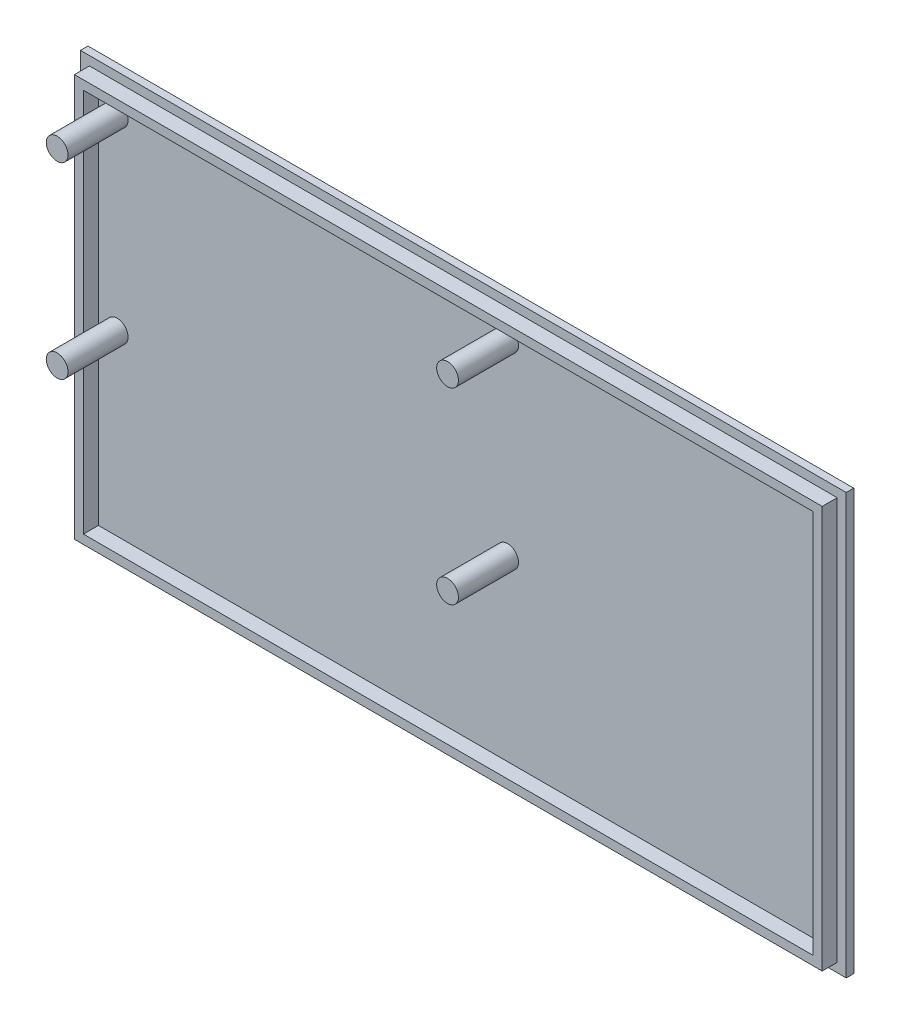
ISO-10303-21;
HEADER;
FILE_DESCRIPTION(('STEP AP214'),'2;1');
FILE_NAME('part.step','',(''),(''),'','','');
FILE_SCHEMA(('AUTOMOTIVE_DESIGN { 1 0 10303 214 1 1 1 1 }'));
ENDSEC;
DATA;
#1=APPLICATION_CONTEXT('core data for automotive mechanical design processes');
#2=APPLICATION_PROTOCOL_DEFINITION('international standard','automotive_design',2000,#1);
#3=PRODUCT_CONTEXT('',#1,'mechanical');
#4=PRODUCT('Part','Part','',(#3));
#5=PRODUCT_RELATED_PRODUCT_CATEGORY('part','',(#4));
#6=PRODUCT_DEFINITION_FORMATION('','',#4);
#7=PRODUCT_DEFINITION_CONTEXT('part definition',#1,'design');
#8=PRODUCT_DEFINITION('design','',#6,#7);
#9=PRODUCT_DEFINITION_SHAPE('','',#8);
#10=(LENGTH_UNIT() NAMED_UNIT(*) SI_UNIT(.MILLI.,.METRE.));
#11=(NAMED_UNIT(*) PLANE_ANGLE_UNIT() SI_UNIT($,.RADIAN.));
#12=(NAMED_UNIT(*) SI_UNIT($,.STERADIAN.) SOLID_ANGLE_UNIT());
#13=UNCERTAINTY_MEASURE_WITH_UNIT(LENGTH_MEASURE(1.E-05),#10,'distance_accuracy_value','');
#14=(GEOMETRIC_REPRESENTATION_CONTEXT(3) GLOBAL_UNCERTAINTY_ASSIGNED_CONTEXT((#13)) GLOBAL_UNIT_ASSIGNED_CONTEXT((#10,
#11,#12)) REPRESENTATION_CONTEXT('',''));
#15=CARTESIAN_POINT('',(0.,0.,0.));
#16=DIRECTION('',(0.,0.,1.));
#17=DIRECTION('',(1.,0.,0.));
#18=AXIS2_PLACEMENT_3D('',#15,#16,#17);
#19=CARTESIAN_POINT('',(0.,0.,1.));
#20=DIRECTION('',(0.,0.,-1.));
#21=DIRECTION('',(-1.,0.,0.));
#22=AXIS2_PLACEMENT_3D('',#19,#20,#21);
#23=PLANE('',#22);
#24=DIRECTION('',(0.,1.,0.));
#25=VECTOR('',#24,1.);
#26=CARTESIAN_POINT('',(51.,-28.,1.));
#27=LINE('',#26,#25);
#28=CARTESIAN_POINT('',(51.,-28.,1.));
#29=VERTEX_POINT('',#28);
#30=CARTESIAN_POINT('',(51.,28.,1.));
#31=VERTEX_POINT('',#30);
#32=EDGE_CURVE('E193',#29,#31,#27,.T.);
#33=ORIENTED_EDGE('',*,*,#32,.T.);
#34=DIRECTION('',(-1.,0.,0.));
#35=VECTOR('',#34,1.);
#36=CARTESIAN_POINT('',(-51.,28.,1.));
#37=LINE('',#36,#35);
#38=CARTESIAN_POINT('',(-51.,28.,1.));
#39=VERTEX_POINT('',#38);
#40=EDGE_CURVE('E196',#31,#39,#37,.T.);
#41=ORIENTED_EDGE('',*,*,#40,.T.);
#42=DIRECTION('',(0.,-1.,0.));
#43=VECTOR('',#42,1.);
#44=CARTESIAN_POINT('',(-51.,-28.,1.));
#45=LINE('',#44,#43);
#46=CARTESIAN_POINT('',(-51.,-28.,1.));
#47=VERTEX_POINT('',#46);
#48=EDGE_CURVE('E199',#39,#47,#45,.T.);
#49=ORIENTED_EDGE('',*,*,#48,.T.);
#50=DIRECTION('',(1.,0.,0.));
#51=VECTOR('',#50,1.);
#52=CARTESIAN_POINT('',(-51.,-28.,1.));
#53=LINE('',#52,#51);
#54=EDGE_CURVE('E201',#47,#29,#53,.T.);
#55=ORIENTED_EDGE('',*,*,#54,.T.);
#56=EDGE_LOOP('',(#33,#41,#49,#55));
#57=FACE_BOUND('',#56,.T.);
#58=DIRECTION('',(0.,1.,0.));
#59=VECTOR('',#58,1.);
#60=CARTESIAN_POINT('',(49.8,-26.8,1.));
#61=LINE('',#60,#59);
#62=CARTESIAN_POINT('',(49.8,-26.8,1.));
#63=VERTEX_POINT('',#62);
#64=CARTESIAN_POINT('',(49.8,26.8,1.));
#65=VERTEX_POINT('',#64);
#66=EDGE_CURVE('E139',#63,#65,#61,.T.);
#67=ORIENTED_EDGE('',*,*,#66,.F.);
#68=DIRECTION('',(1.,0.,0.));
#69=VECTOR('',#68,1.);
#70=CARTESIAN_POINT('',(-49.8,-26.8,1.));
#71=LINE('',#70,#69);
#72=CARTESIAN_POINT('',(-49.8,-26.8,1.));
#73=VERTEX_POINT('',#72);
#74=EDGE_CURVE('E169',#73,#63,#71,.T.);
#75=ORIENTED_EDGE('',*,*,#74,.F.);
#76=DIRECTION('',(0.,-1.,0.));
#77=VECTOR('',#76,1.);
#78=CARTESIAN_POINT('',(-49.8,-26.8,1.));
#79=LINE('',#78,#77);
#80=CARTESIAN_POINT('',(-49.8,26.8,1.));
#81=VERTEX_POINT('',#80);
#82=EDGE_CURVE('E53',#81,#73,#79,.T.);
#83=ORIENTED_EDGE('',*,*,#82,.F.);
#84=DIRECTION('',(-1.,0.,0.));
#85=VECTOR('',#84,1.);
#86=CARTESIAN_POINT('',(-49.8,26.8,1.));
#87=LINE('',#86,#85);
#88=EDGE_CURVE('E48',#65,#81,#87,.T.);
#89=ORIENTED_EDGE('',*,*,#88,.F.);
#90=EDGE_LOOP('',(#67,#75,#83,#89));
#91=FACE_BOUND('',#90,.T.);
#92=ADVANCED_FACE('F33',(#57,#91),#23,.F.);
#93=CARTESIAN_POINT('',(51.,-28.,1.));
#94=DIRECTION('',(-1.,0.,0.));
#95=DIRECTION('',(0.,0.,1.));
#96=AXIS2_PLACEMENT_3D('',#93,#94,#95);
#97=PLANE('',#96);
#98=DIRECTION('',(0.,1.,0.));
#99=VECTOR('',#98,1.);
#100=CARTESIAN_POINT('',(51.,-28.,0.));
#101=LINE('',#100,#99);
#102=CARTESIAN_POINT('',(51.,-28.,0.));
#103=VERTEX_POINT('',#102);
#104=CARTESIAN_POINT('',(51.,28.,0.));
#105=VERTEX_POINT('',#104);
#106=EDGE_CURVE('E192',#103,#105,#101,.T.);
#107=ORIENTED_EDGE('',*,*,#106,.T.);
#108=DIRECTION('',(0.,0.,-1.));
#109=VECTOR('',#108,1.);
#110=CARTESIAN_POINT('',(51.,28.,1.));
#111=LINE('',#110,#109);
#112=EDGE_CURVE('E219',#31,#105,#111,.T.);
#113=ORIENTED_EDGE('',*,*,#112,.F.);
#114=ORIENTED_EDGE('',*,*,#32,.F.);
#115=DIRECTION('',(0.,0.,-1.));
#116=VECTOR('',#115,1.);
#117=CARTESIAN_POINT('',(51.,-28.,1.));
#118=LINE('',#117,#116);
#119=EDGE_CURVE('E203',#29,#103,#118,.T.);
#120=ORIENTED_EDGE('',*,*,#119,.T.);
#121=EDGE_LOOP('',(#107,#113,#114,#120));
#122=FACE_BOUND('',#121,.T.);
#123=ADVANCED_FACE('F35',(#122),#97,.F.);
#124=CARTESIAN_POINT('',(-51.,28.,1.));
#125=DIRECTION('',(0.,-1.,0.));
#126=DIRECTION('',(0.,0.,-1.));
#127=AXIS2_PLACEMENT_3D('',#124,#125,#126);
#128=PLANE('',#127);
#129=DIRECTION('',(-1.,0.,0.));
#130=VECTOR('',#129,1.);
#131=CARTESIAN_POINT('',(-51.,28.,0.));
#132=LINE('',#131,#130);
#133=CARTESIAN_POINT('',(-51.,28.,0.));
#134=VERTEX_POINT('',#133);
#135=EDGE_CURVE('E206',#105,#134,#132,.T.);
#136=ORIENTED_EDGE('',*,*,#135,.T.);
#137=DIRECTION('',(0.,0.,-1.));
#138=VECTOR('',#137,1.);
#139=CARTESIAN_POINT('',(-51.,28.,1.));
#140=LINE('',#139,#138);
#141=EDGE_CURVE('E216',#39,#134,#140,.T.);
#142=ORIENTED_EDGE('',*,*,#141,.F.);
#143=ORIENTED_EDGE('',*,*,#40,.F.);
#144=ORIENTED_EDGE('',*,*,#112,.T.);
#145=EDGE_LOOP('',(#136,#142,#143,#144));
#146=FACE_BOUND('',#145,.T.);
#147=ADVANCED_FACE('F261',(#146),#128,.F.);
#148=CARTESIAN_POINT('',(-51.,-28.,1.));
#149=DIRECTION('',(1.,0.,0.));
#150=DIRECTION('',(0.,0.,-1.));
#151=AXIS2_PLACEMENT_3D('',#148,#149,#150);
#152=PLANE('',#151);
#153=DIRECTION('',(0.,-1.,0.));
#154=VECTOR('',#153,1.);
#155=CARTESIAN_POINT('',(-51.,-28.,0.));
#156=LINE('',#155,#154);
#157=CARTESIAN_POINT('',(-51.,-28.,0.));
#158=VERTEX_POINT('',#157);
#159=EDGE_CURVE('E208',#134,#158,#156,.T.);
#160=ORIENTED_EDGE('',*,*,#159,.T.);
#161=DIRECTION('',(0.,0.,-1.));
#162=VECTOR('',#161,1.);
#163=CARTESIAN_POINT('',(-51.,-28.,1.));
#164=LINE('',#163,#162);
#165=EDGE_CURVE('E213',#47,#158,#164,.T.);
#166=ORIENTED_EDGE('',*,*,#165,.F.);
#167=ORIENTED_EDGE('',*,*,#48,.F.);
#168=ORIENTED_EDGE('',*,*,#141,.T.);
#169=EDGE_LOOP('',(#160,#166,#167,#168));
#170=FACE_BOUND('',#169,.T.);
#171=ADVANCED_FACE('F274',(#170),#152,.F.);
#172=CARTESIAN_POINT('',(-51.,-28.,1.));
#173=DIRECTION('',(0.,1.,0.));
#174=DIRECTION('',(0.,0.,1.));
#175=AXIS2_PLACEMENT_3D('',#172,#173,#174);
#176=PLANE('',#175);
#177=DIRECTION('',(1.,0.,0.));
#178=VECTOR('',#177,1.);
#179=CARTESIAN_POINT('',(-51.,-28.,0.));
#180=LINE('',#179,#178);
#181=EDGE_CURVE('E197',#158,#103,#180,.T.);
#182=ORIENTED_EDGE('',*,*,#181,.T.);
#183=ORIENTED_EDGE('',*,*,#119,.F.);
#184=ORIENTED_EDGE('',*,*,#54,.F.);
#185=ORIENTED_EDGE('',*,*,#165,.T.);
#186=EDGE_LOOP('',(#182,#183,#184,#185));
#187=FACE_BOUND('',#186,.T.);
#188=ADVANCED_FACE('F270',(#187),#176,.F.);
#189=CARTESIAN_POINT('',(0.,0.,0.));
#190=DIRECTION('',(0.,0.,-1.));
#191=DIRECTION('',(-1.,0.,0.));
#192=AXIS2_PLACEMENT_3D('',#189,#190,#191);
#193=PLANE('',#192);
#194=ORIENTED_EDGE('',*,*,#106,.F.);
#195=ORIENTED_EDGE('',*,*,#181,.F.);
#196=ORIENTED_EDGE('',*,*,#159,.F.);
#197=ORIENTED_EDGE('',*,*,#135,.F.);
#198=EDGE_LOOP('',(#194,#195,#196,#197));
#199=FACE_BOUND('',#198,.T.);
#200=ADVANCED_FACE('F267',(#199),#193,.T.);
#201=CARTESIAN_POINT('',(0.,0.,3.));
#202=DIRECTION('',(0.,0.,-1.));
#203=DIRECTION('',(-1.,0.,0.));
#204=AXIS2_PLACEMENT_3D('',#201,#202,#203);
#205=PLANE('',#204);
#206=DIRECTION('',(0.,1.,0.));
#207=VECTOR('',#206,1.);
#208=CARTESIAN_POINT('',(49.8,-26.8,3.));
#209=LINE('',#208,#207);
#210=CARTESIAN_POINT('',(49.8,-26.8,3.));
#211=VERTEX_POINT('',#210);
#212=CARTESIAN_POINT('',(49.8,26.8,3.));
#213=VERTEX_POINT('',#212);
#214=EDGE_CURVE('E165',#211,#213,#209,.T.);
#215=ORIENTED_EDGE('',*,*,#214,.T.);
#216=DIRECTION('',(-1.,0.,0.));
#217=VECTOR('',#216,1.);
#218=CARTESIAN_POINT('',(-49.8,26.8,3.));
#219=LINE('',#218,#217);
#220=CARTESIAN_POINT('',(-49.8,26.8,3.));
#221=VERTEX_POINT('',#220);
#222=EDGE_CURVE('E168',#213,#221,#219,.T.);
#223=ORIENTED_EDGE('',*,*,#222,.T.);
#224=DIRECTION('',(0.,-1.,0.));
#225=VECTOR('',#224,1.);
#226=CARTESIAN_POINT('',(-49.8,-26.8,3.));
#227=LINE('',#226,#225);
#228=CARTESIAN_POINT('',(-49.8,-26.8,3.));
#229=VERTEX_POINT('',#228);
#230=EDGE_CURVE('E171',#221,#229,#227,.T.);
#231=ORIENTED_EDGE('',*,*,#230,.T.);
#232=DIRECTION('',(1.,0.,0.));
#233=VECTOR('',#232,1.);
#234=CARTESIAN_POINT('',(-49.8,-26.8,3.));
#235=LINE('',#234,#233);
#236=EDGE_CURVE('E173',#229,#211,#235,.T.);
#237=ORIENTED_EDGE('',*,*,#236,.T.);
#238=EDGE_LOOP('',(#215,#223,#231,#237));
#239=FACE_BOUND('',#238,.T.);
#240=DIRECTION('',(0.,1.,0.));
#241=VECTOR('',#240,1.);
#242=CARTESIAN_POINT('',(48.6,-25.6,3.));
#243=LINE('',#242,#241);
#244=CARTESIAN_POINT('',(48.6,-25.6,3.));
#245=VERTEX_POINT('',#244);
#246=CARTESIAN_POINT('',(48.6,25.6,3.));
#247=VERTEX_POINT('',#246);
#248=EDGE_CURVE('E121',#245,#247,#243,.T.);
#249=ORIENTED_EDGE('',*,*,#248,.F.);
#250=DIRECTION('',(1.,0.,0.));
#251=VECTOR('',#250,1.);
#252=CARTESIAN_POINT('',(-48.6,-25.6,3.));
#253=LINE('',#252,#251);
#254=CARTESIAN_POINT('',(-48.6,-25.6,3.));
#255=VERTEX_POINT('',#254);
#256=EDGE_CURVE('E147',#255,#245,#253,.T.);
#257=ORIENTED_EDGE('',*,*,#256,.F.);
#258=DIRECTION('',(0.,-1.,0.));
#259=VECTOR('',#258,1.);
#260=CARTESIAN_POINT('',(-48.6,-25.6,3.));
#261=LINE('',#260,#259);
#262=CARTESIAN_POINT('',(-48.6,25.6,3.));
#263=VERTEX_POINT('',#262);
#264=EDGE_CURVE('E145',#263,#255,#261,.T.);
#265=ORIENTED_EDGE('',*,*,#264,.F.);
#266=DIRECTION('',(-1.,0.,0.));
#267=VECTOR('',#266,1.);
#268=CARTESIAN_POINT('',(-48.6,25.6,3.));
#269=LINE('',#268,#267);
#270=EDGE_CURVE('E131',#247,#263,#269,.T.);
#271=ORIENTED_EDGE('',*,*,#270,.F.);
#272=EDGE_LOOP('',(#249,#257,#265,#271));
#273=FACE_BOUND('',#272,.T.);
#274=ADVANCED_FACE('F143',(#239,#273),#205,.F.);
#275=CARTESIAN_POINT('',(49.8,-26.8,3.));
#276=DIRECTION('',(-1.,0.,0.));
#277=DIRECTION('',(0.,0.,1.));
#278=AXIS2_PLACEMENT_3D('',#275,#276,#277);
#279=PLANE('',#278);
#280=ORIENTED_EDGE('',*,*,#66,.T.);
#281=DIRECTION('',(0.,0.,-1.));
#282=VECTOR('',#281,1.);
#283=CARTESIAN_POINT('',(49.8,26.8,3.));
#284=LINE('',#283,#282);
#285=EDGE_CURVE('E190',#213,#65,#284,.T.);
#286=ORIENTED_EDGE('',*,*,#285,.F.);
#287=ORIENTED_EDGE('',*,*,#214,.F.);
#288=DIRECTION('',(0.,0.,-1.));
#289=VECTOR('',#288,1.);
#290=CARTESIAN_POINT('',(49.8,-26.8,3.));
#291=LINE('',#290,#289);
#292=EDGE_CURVE('E175',#211,#63,#291,.T.);
#293=ORIENTED_EDGE('',*,*,#292,.T.);
#294=EDGE_LOOP('',(#280,#286,#287,#293));
#295=FACE_BOUND('',#294,.T.);
#296=ADVANCED_FACE('F265',(#295),#279,.F.);
#297=CARTESIAN_POINT('',(-49.8,26.8,3.));
#298=DIRECTION('',(0.,-1.,0.));
#299=DIRECTION('',(0.,0.,-1.));
#300=AXIS2_PLACEMENT_3D('',#297,#298,#299);
#301=PLANE('',#300);
#302=ORIENTED_EDGE('',*,*,#88,.T.);
#303=DIRECTION('',(0.,0.,-1.));
#304=VECTOR('',#303,1.);
#305=CARTESIAN_POINT('',(-49.8,26.8,3.));
#306=LINE('',#305,#304);
#307=EDGE_CURVE('E187',#221,#81,#306,.T.);
#308=ORIENTED_EDGE('',*,*,#307,.F.);
#309=ORIENTED_EDGE('',*,*,#222,.F.);
#310=ORIENTED_EDGE('',*,*,#285,.T.);
#311=EDGE_LOOP('',(#302,#308,#309,#310));
#312=FACE_BOUND('',#311,.T.);
#313=ADVANCED_FACE('F319',(#312),#301,.F.);
#314=CARTESIAN_POINT('',(-49.8,-26.8,3.));
#315=DIRECTION('',(1.,0.,0.));
#316=DIRECTION('',(0.,0.,-1.));
#317=AXIS2_PLACEMENT_3D('',#314,#315,#316);
#318=PLANE('',#317);
#319=ORIENTED_EDGE('',*,*,#82,.T.);
#320=DIRECTION('',(0.,0.,-1.));
#321=VECTOR('',#320,1.);
#322=CARTESIAN_POINT('',(-49.8,-26.8,3.));
#323=LINE('',#322,#321);
#324=EDGE_CURVE('E184',#229,#73,#323,.T.);
#325=ORIENTED_EDGE('',*,*,#324,.F.);
#326=ORIENTED_EDGE('',*,*,#230,.F.);
#327=ORIENTED_EDGE('',*,*,#307,.T.);
#328=EDGE_LOOP('',(#319,#325,#326,#327));
#329=FACE_BOUND('',#328,.T.);
#330=ADVANCED_FACE('F326',(#329),#318,.F.);
#331=CARTESIAN_POINT('',(-49.8,-26.8,3.));
#332=DIRECTION('',(0.,1.,0.));
#333=DIRECTION('',(0.,0.,1.));
#334=AXIS2_PLACEMENT_3D('',#331,#332,#333);
#335=PLANE('',#334);
#336=ORIENTED_EDGE('',*,*,#74,.T.);
#337=ORIENTED_EDGE('',*,*,#292,.F.);
#338=ORIENTED_EDGE('',*,*,#236,.F.);
#339=ORIENTED_EDGE('',*,*,#324,.T.);
#340=EDGE_LOOP('',(#336,#337,#338,#339));
#341=FACE_BOUND('',#340,.T.);
#342=ADVANCED_FACE('F333',(#341),#335,.F.);
#343=CARTESIAN_POINT('',(48.6,-25.6,3.));
#344=DIRECTION('',(-1.,0.,0.));
#345=DIRECTION('',(0.,0.,1.));
#346=AXIS2_PLACEMENT_3D('',#343,#344,#345);
#347=PLANE('',#346);
#348=DIRECTION('',(0.,1.,0.));
#349=VECTOR('',#348,1.);
#350=CARTESIAN_POINT('',(48.6,-25.6,1.));
#351=LINE('',#350,#349);
#352=CARTESIAN_POINT('',(48.6,-25.6,1.));
#353=VERTEX_POINT('',#352);
#354=CARTESIAN_POINT('',(48.6,25.6,1.));
#355=VERTEX_POINT('',#354);
#356=EDGE_CURVE('E152',#353,#355,#351,.T.);
#357=ORIENTED_EDGE('',*,*,#356,.F.);
#358=DIRECTION('',(0.,0.,-1.));
#359=VECTOR('',#358,1.);
#360=CARTESIAN_POINT('',(48.6,-25.6,3.));
#361=LINE('',#360,#359);
#362=EDGE_CURVE('E127',#245,#353,#361,.T.);
#363=ORIENTED_EDGE('',*,*,#362,.F.);
#364=ORIENTED_EDGE('',*,*,#248,.T.);
#365=DIRECTION('',(0.,0.,-1.));
#366=VECTOR('',#365,1.);
#367=CARTESIAN_POINT('',(48.6,25.6,3.));
#368=LINE('',#367,#366);
#369=EDGE_CURVE('E125',#247,#355,#368,.T.);
#370=ORIENTED_EDGE('',*,*,#369,.T.);
#371=EDGE_LOOP('',(#357,#363,#364,#370));
#372=FACE_BOUND('',#371,.T.);
#373=ADVANCED_FACE('F124',(#372),#347,.T.);
#374=CARTESIAN_POINT('',(-48.6,25.6,3.));
#375=DIRECTION('',(0.,-1.,0.));
#376=DIRECTION('',(0.,0.,-1.));
#377=AXIS2_PLACEMENT_3D('',#374,#375,#376);
#378=PLANE('',#377);
#379=DIRECTION('',(-1.,0.,0.));
#380=VECTOR('',#379,1.);
#381=CARTESIAN_POINT('',(-48.6,25.6,1.));
#382=LINE('',#381,#380);
#383=CARTESIAN_POINT('',(-48.6,25.6,1.));
#384=VERTEX_POINT('',#383);
#385=EDGE_CURVE('E138',#355,#384,#382,.T.);
#386=ORIENTED_EDGE('',*,*,#385,.F.);
#387=ORIENTED_EDGE('',*,*,#369,.F.);
#388=ORIENTED_EDGE('',*,*,#270,.T.);
#389=DIRECTION('',(0.,0.,-1.));
#390=VECTOR('',#389,1.);
#391=CARTESIAN_POINT('',(-48.6,25.6,3.));
#392=LINE('',#391,#390);
#393=EDGE_CURVE('E140',#263,#384,#392,.T.);
#394=ORIENTED_EDGE('',*,*,#393,.T.);
#395=EDGE_LOOP('',(#386,#387,#388,#394));
#396=FACE_BOUND('',#395,.T.);
#397=ADVANCED_FACE('F135',(#396),#378,.T.);
#398=CARTESIAN_POINT('',(-48.6,-25.6,3.));
#399=DIRECTION('',(1.,0.,0.));
#400=DIRECTION('',(0.,0.,-1.));
#401=AXIS2_PLACEMENT_3D('',#398,#399,#400);
#402=PLANE('',#401);
#403=DIRECTION('',(0.,-1.,0.));
#404=VECTOR('',#403,1.);
#405=CARTESIAN_POINT('',(-48.6,-25.6,1.));
#406=LINE('',#405,#404);
#407=CARTESIAN_POINT('',(-48.6,-25.6,1.));
#408=VERTEX_POINT('',#407);
#409=EDGE_CURVE('E156',#384,#408,#406,.T.);
#410=ORIENTED_EDGE('',*,*,#409,.F.);
#411=ORIENTED_EDGE('',*,*,#393,.F.);
#412=ORIENTED_EDGE('',*,*,#264,.T.);
#413=DIRECTION('',(0.,0.,-1.));
#414=VECTOR('',#413,1.);
#415=CARTESIAN_POINT('',(-48.6,-25.6,3.));
#416=LINE('',#415,#414);
#417=EDGE_CURVE('E162',#255,#408,#416,.T.);
#418=ORIENTED_EDGE('',*,*,#417,.T.);
#419=EDGE_LOOP('',(#410,#411,#412,#418));
#420=FACE_BOUND('',#419,.T.);
#421=ADVANCED_FACE('F247',(#420),#402,.T.);
#422=CARTESIAN_POINT('',(-48.6,-25.6,3.));
#423=DIRECTION('',(0.,1.,0.));
#424=DIRECTION('',(0.,0.,1.));
#425=AXIS2_PLACEMENT_3D('',#422,#423,#424);
#426=PLANE('',#425);
#427=DIRECTION('',(1.,0.,0.));
#428=VECTOR('',#427,1.);
#429=CARTESIAN_POINT('',(-48.6,-25.6,1.));
#430=LINE('',#429,#428);
#431=EDGE_CURVE('E132',#408,#353,#430,.T.);
#432=ORIENTED_EDGE('',*,*,#431,.F.);
#433=ORIENTED_EDGE('',*,*,#417,.F.);
#434=ORIENTED_EDGE('',*,*,#256,.T.);
#435=ORIENTED_EDGE('',*,*,#362,.T.);
#436=EDGE_LOOP('',(#432,#433,#434,#435));
#437=FACE_BOUND('',#436,.T.);
#438=ADVANCED_FACE('F236',(#437),#426,.T.);
#439=CARTESIAN_POINT('',(5.90000000000002,-1.90000000000001,1.));
#440=DIRECTION('',(0.,0.,-1.));
#441=DIRECTION('',(-1.,0.,0.));
#442=AXIS2_PLACEMENT_3D('',#439,#440,#441);
#443=CIRCLE('',#442,1.45);
#444=CARTESIAN_POINT('',(4.45000000000002,-1.90000000000001,1.));
#445=VERTEX_POINT('',#444);
#446=EDGE_CURVE('E11',#445,#445,#443,.F.);
#447=ORIENTED_EDGE('',*,*,#446,.F.);
#448=EDGE_LOOP('',(#447));
#449=FACE_BOUND('',#448,.T.);
#450=CARTESIAN_POINT('',(5.90000000000002,23.1,1.));
#451=DIRECTION('',(0.,0.,-1.));
#452=DIRECTION('',(-1.,0.,0.));
#453=AXIS2_PLACEMENT_3D('',#450,#451,#452);
#454=CIRCLE('',#453,1.45);
#455=CARTESIAN_POINT('',(4.45000000000002,23.1,1.));
#456=VERTEX_POINT('',#455);
#457=EDGE_CURVE('E41',#456,#456,#454,.F.);
#458=ORIENTED_EDGE('',*,*,#457,.F.);
#459=EDGE_LOOP('',(#458));
#460=FACE_BOUND('',#459,.T.);
#461=CARTESIAN_POINT('',(-46.1,-1.90000000000001,1.));
#462=DIRECTION('',(0.,0.,-1.));
#463=DIRECTION('',(-1.,0.,0.));
#464=AXIS2_PLACEMENT_3D('',#461,#462,#463);
#465=CIRCLE('',#464,1.45);
#466=CARTESIAN_POINT('',(-47.55,-1.90000000000001,1.));
#467=VERTEX_POINT('',#466);
#468=EDGE_CURVE('E225',#467,#467,#465,.F.);
#469=ORIENTED_EDGE('',*,*,#468,.F.);
#470=EDGE_LOOP('',(#469));
#471=FACE_BOUND('',#470,.T.);
#472=CARTESIAN_POINT('',(-46.1,23.1,1.));
#473=DIRECTION('',(0.,0.,-1.));
#474=DIRECTION('',(-1.,0.,0.));
#475=AXIS2_PLACEMENT_3D('',#472,#473,#474);
#476=CIRCLE('',#475,1.45);
#477=CARTESIAN_POINT('',(-47.55,23.1,1.));
#478=VERTEX_POINT('',#477);
#479=EDGE_CURVE('E222',#478,#478,#476,.F.);
#480=ORIENTED_EDGE('',*,*,#479,.F.);
#481=EDGE_LOOP('',(#480));
#482=FACE_BOUND('',#481,.T.);
#483=ORIENTED_EDGE('',*,*,#431,.T.);
#484=ORIENTED_EDGE('',*,*,#356,.T.);
#485=ORIENTED_EDGE('',*,*,#385,.T.);
#486=ORIENTED_EDGE('',*,*,#409,.T.);
#487=EDGE_LOOP('',(#483,#484,#485,#486));
#488=FACE_BOUND('',#487,.T.);
#489=ADVANCED_FACE('F232',(#449,#460,#471,#482,#488),#23,.F.);
#490=CARTESIAN_POINT('',(-46.1,23.1,9.));
#491=DIRECTION('',(0.,0.,-1.));
#492=DIRECTION('',(-1.,0.,0.));
#493=AXIS2_PLACEMENT_3D('',#490,#491,#492);
#494=CYLINDRICAL_SURFACE('',#493,1.45);
#495=CARTESIAN_POINT('',(-46.1,23.1,9.));
#496=DIRECTION('',(0.,0.,1.));
#497=DIRECTION('',(1.,0.,0.));
#498=AXIS2_PLACEMENT_3D('',#495,#496,#497);
#499=CIRCLE('',#498,1.45);
#500=CARTESIAN_POINT('',(-44.65,23.1,9.));
#501=VERTEX_POINT('',#500);
#502=EDGE_CURVE('E154',#501,#501,#499,.T.);
#503=ORIENTED_EDGE('',*,*,#502,.F.);
#504=EDGE_LOOP('',(#503));
#505=FACE_BOUND('',#504,.T.);
#506=ORIENTED_EDGE('',*,*,#479,.T.);
#507=EDGE_LOOP('',(#506));
#508=FACE_BOUND('',#507,.T.);
#509=ADVANCED_FACE('F235',(#505,#508),#494,.T.);
#510=CARTESIAN_POINT('',(-46.1,23.1,9.));
#511=DIRECTION('',(0.,0.,1.));
#512=DIRECTION('',(1.,0.,0.));
#513=AXIS2_PLACEMENT_3D('',#510,#511,#512);
#514=PLANE('',#513);
#515=ORIENTED_EDGE('',*,*,#502,.T.);
#516=EDGE_LOOP('',(#515));
#517=FACE_BOUND('',#516,.T.);
#518=ADVANCED_FACE('F377',(#517),#514,.T.);
#519=CARTESIAN_POINT('',(-46.1,-1.90000000000001,9.));
#520=DIRECTION('',(0.,0.,-1.));
#521=DIRECTION('',(-1.,0.,0.));
#522=AXIS2_PLACEMENT_3D('',#519,#520,#521);
#523=CYLINDRICAL_SURFACE('',#522,1.45);
#524=CARTESIAN_POINT('',(-46.1,-1.90000000000001,9.));
#525=DIRECTION('',(0.,0.,1.));
#526=DIRECTION('',(1.,0.,0.));
#527=AXIS2_PLACEMENT_3D('',#524,#525,#526);
#528=CIRCLE('',#527,1.45);
#529=CARTESIAN_POINT('',(-44.65,-1.90000000000001,9.));
#530=VERTEX_POINT('',#529);
#531=EDGE_CURVE('E456',#530,#530,#528,.T.);
#532=ORIENTED_EDGE('',*,*,#531,.F.);
#533=EDGE_LOOP('',(#532));
#534=FACE_BOUND('',#533,.T.);
#535=ORIENTED_EDGE('',*,*,#468,.T.);
#536=EDGE_LOOP('',(#535));
#537=FACE_BOUND('',#536,.T.);
#538=ADVANCED_FACE('F387',(#534,#537),#523,.T.);
#539=CARTESIAN_POINT('',(-46.1,-1.90000000000001,9.));
#540=DIRECTION('',(0.,0.,1.));
#541=DIRECTION('',(1.,0.,0.));
#542=AXIS2_PLACEMENT_3D('',#539,#540,#541);
#543=PLANE('',#542);
#544=ORIENTED_EDGE('',*,*,#531,.T.);
#545=EDGE_LOOP('',(#544));
#546=FACE_BOUND('',#545,.T.);
#547=ADVANCED_FACE('F397',(#546),#543,.T.);
#548=CARTESIAN_POINT('',(5.90000000000002,23.1,9.));
#549=DIRECTION('',(0.,0.,-1.));
#550=DIRECTION('',(-1.,0.,0.));
#551=AXIS2_PLACEMENT_3D('',#548,#549,#550);
#552=CYLINDRICAL_SURFACE('',#551,1.45);
#553=CARTESIAN_POINT('',(5.90000000000002,23.1,9.));
#554=DIRECTION('',(0.,0.,1.));
#555=DIRECTION('',(1.,0.,0.));
#556=AXIS2_PLACEMENT_3D('',#553,#554,#555);
#557=CIRCLE('',#556,1.45);
#558=CARTESIAN_POINT('',(7.35000000000002,23.1,9.));
#559=VERTEX_POINT('',#558);
#560=EDGE_CURVE('E453',#559,#559,#557,.T.);
#561=ORIENTED_EDGE('',*,*,#560,.F.);
#562=EDGE_LOOP('',(#561));
#563=FACE_BOUND('',#562,.T.);
#564=ORIENTED_EDGE('',*,*,#457,.T.);
#565=EDGE_LOOP('',(#564));
#566=FACE_BOUND('',#565,.T.);
#567=ADVANCED_FACE('F230',(#563,#566),#552,.T.);
#568=CARTESIAN_POINT('',(5.90000000000002,23.1,9.));
#569=DIRECTION('',(0.,0.,1.));
#570=DIRECTION('',(1.,0.,0.));
#571=AXIS2_PLACEMENT_3D('',#568,#569,#570);
#572=PLANE('',#571);
#573=ORIENTED_EDGE('',*,*,#560,.T.);
#574=EDGE_LOOP('',(#573));
#575=FACE_BOUND('',#574,.T.);
#576=ADVANCED_FACE('F416',(#575),#572,.T.);
#577=CARTESIAN_POINT('',(5.90000000000002,-1.90000000000001,9.));
#578=DIRECTION('',(0.,0.,-1.));
#579=DIRECTION('',(-1.,0.,0.));
#580=AXIS2_PLACEMENT_3D('',#577,#578,#579);
#581=CYLINDRICAL_SURFACE('',#580,1.45);
#582=CARTESIAN_POINT('',(5.90000000000002,-1.90000000000001,9.));
#583=DIRECTION('',(0.,0.,1.));
#584=DIRECTION('',(1.,0.,0.));
#585=AXIS2_PLACEMENT_3D('',#582,#583,#584);
#586=CIRCLE('',#585,1.45);
#587=CARTESIAN_POINT('',(7.35000000000002,-1.90000000000001,9.));
#588=VERTEX_POINT('',#587);
#589=EDGE_CURVE('E452',#588,#588,#586,.T.);
#590=ORIENTED_EDGE('',*,*,#589,.F.);
#591=EDGE_LOOP('',(#590));
#592=FACE_BOUND('',#591,.T.);
#593=ORIENTED_EDGE('',*,*,#446,.T.);
#594=EDGE_LOOP('',(#593));
#595=FACE_BOUND('',#594,.T.);
#596=ADVANCED_FACE('F426',(#592,#595),#581,.T.);
#597=CARTESIAN_POINT('',(5.90000000000002,-1.90000000000001,9.));
#598=DIRECTION('',(0.,0.,1.));
#599=DIRECTION('',(1.,0.,0.));
#600=AXIS2_PLACEMENT_3D('',#597,#598,#599);
#601=PLANE('',#600);
#602=ORIENTED_EDGE('',*,*,#589,.T.);
#603=EDGE_LOOP('',(#602));
#604=FACE_BOUND('',#603,.T.);
#605=ADVANCED_FACE('F436',(#604),#601,.T.);
#606=CLOSED_SHELL('',(#92,#123,#147,#171,#188,#200,#274,#296,#313,#330,#342,#373,#397,#421,#438,
#489,#509,#518,#538,#547,#567,#576,#596,#605));
#607=MANIFOLD_SOLID_BREP('B2',#606);
#608=ADVANCED_BREP_SHAPE_REPRESENTATION('',(#18,#607),#14);
#609=SHAPE_DEFINITION_REPRESENTATION(#9,#608);
ENDSEC;
END-ISO-10303-21;
